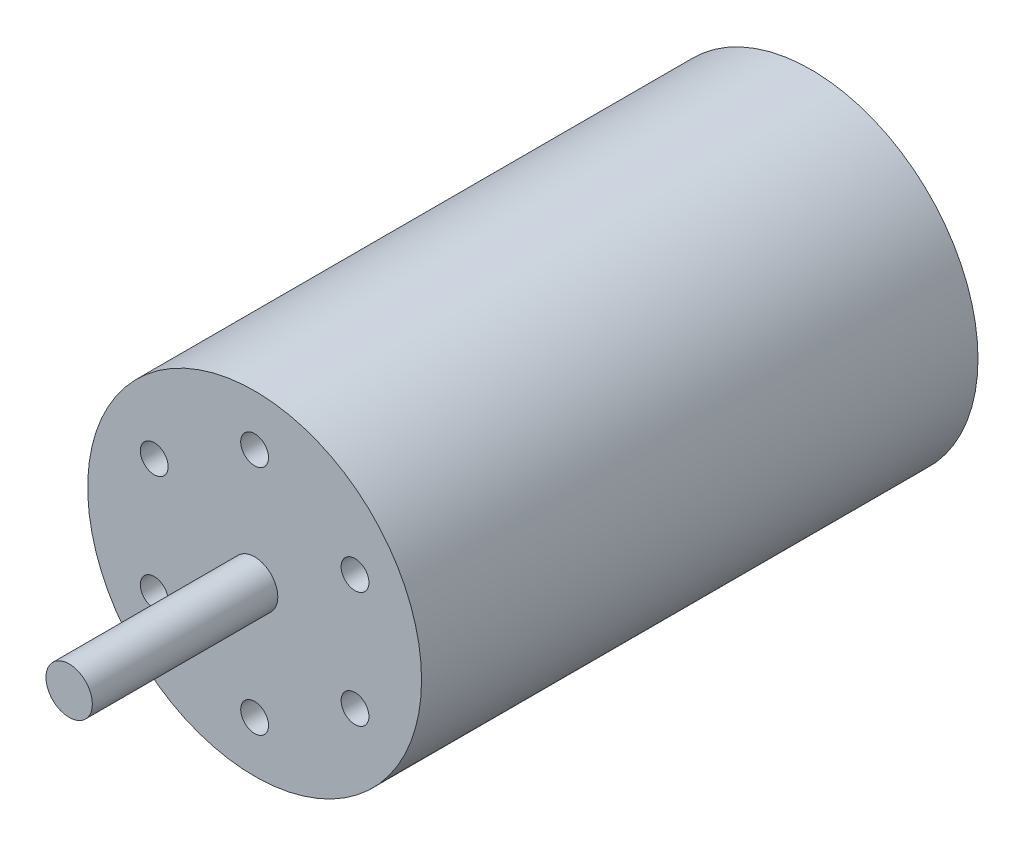
ISO-10303-21;
HEADER;
FILE_DESCRIPTION(('STEP AP214'),'2;1');
FILE_NAME('part.step','',(''),(''),'','','');
FILE_SCHEMA(('AUTOMOTIVE_DESIGN { 1 0 10303 214 1 1 1 1 }'));
ENDSEC;
DATA;
#1=APPLICATION_CONTEXT('core data for automotive mechanical design processes');
#2=APPLICATION_PROTOCOL_DEFINITION('international standard','automotive_design',2000,#1);
#3=PRODUCT_CONTEXT('',#1,'mechanical');
#4=PRODUCT('Part','Part','',(#3));
#5=PRODUCT_RELATED_PRODUCT_CATEGORY('part','',(#4));
#6=PRODUCT_DEFINITION_FORMATION('','',#4);
#7=PRODUCT_DEFINITION_CONTEXT('part definition',#1,'design');
#8=PRODUCT_DEFINITION('design','',#6,#7);
#9=PRODUCT_DEFINITION_SHAPE('','',#8);
#10=(LENGTH_UNIT() NAMED_UNIT(*) SI_UNIT(.MILLI.,.METRE.));
#11=(NAMED_UNIT(*) PLANE_ANGLE_UNIT() SI_UNIT($,.RADIAN.));
#12=(NAMED_UNIT(*) SI_UNIT($,.STERADIAN.) SOLID_ANGLE_UNIT());
#13=UNCERTAINTY_MEASURE_WITH_UNIT(LENGTH_MEASURE(1.E-05),#10,'distance_accuracy_value','');
#14=(GEOMETRIC_REPRESENTATION_CONTEXT(3) GLOBAL_UNCERTAINTY_ASSIGNED_CONTEXT((#13)) GLOBAL_UNIT_ASSIGNED_CONTEXT((#10,
#11,#12)) REPRESENTATION_CONTEXT('',''));
#15=CARTESIAN_POINT('',(0.,0.,0.));
#16=DIRECTION('',(0.,0.,1.));
#17=DIRECTION('',(1.,0.,0.));
#18=AXIS2_PLACEMENT_3D('',#15,#16,#17);
#19=CARTESIAN_POINT('',(0.,0.,60.));
#20=DIRECTION('',(0.,0.,-1.));
#21=DIRECTION('',(-1.,0.,0.));
#22=AXIS2_PLACEMENT_3D('',#19,#20,#21);
#23=CYLINDRICAL_SURFACE('',#22,18.);
#24=CARTESIAN_POINT('',(0.,0.,60.));
#25=DIRECTION('',(0.,0.,1.));
#26=DIRECTION('',(1.,0.,0.));
#27=AXIS2_PLACEMENT_3D('',#24,#25,#26);
#28=CIRCLE('',#27,18.);
#29=CARTESIAN_POINT('',(18.,0.,60.));
#30=VERTEX_POINT('',#29);
#31=EDGE_CURVE('E10',#30,#30,#28,.T.);
#32=ORIENTED_EDGE('',*,*,#31,.F.);
#33=EDGE_LOOP('',(#32));
#34=FACE_BOUND('',#33,.T.);
#35=CARTESIAN_POINT('',(0.,0.,0.));
#36=DIRECTION('',(0.,0.,1.));
#37=DIRECTION('',(1.,0.,0.));
#38=AXIS2_PLACEMENT_3D('',#35,#36,#37);
#39=CIRCLE('',#38,18.);
#40=CARTESIAN_POINT('',(18.,0.,0.));
#41=VERTEX_POINT('',#40);
#42=EDGE_CURVE('E34',#41,#41,#39,.T.);
#43=ORIENTED_EDGE('',*,*,#42,.T.);
#44=EDGE_LOOP('',(#43));
#45=FACE_BOUND('',#44,.T.);
#46=ADVANCED_FACE('F31',(#34,#45),#23,.T.);
#47=CARTESIAN_POINT('',(0.,0.,60.));
#48=DIRECTION('',(0.,0.,1.));
#49=DIRECTION('',(1.,0.,0.));
#50=AXIS2_PLACEMENT_3D('',#47,#48,#49);
#51=PLANE('',#50);
#52=CARTESIAN_POINT('',(10.8253175473058,6.25000000000062,60.));
#53=DIRECTION('',(0.,0.,1.));
#54=DIRECTION('',(1.,0.,0.));
#55=AXIS2_PLACEMENT_3D('',#52,#53,#54);
#56=CIRCLE('',#55,1.50000000000019);
#57=CARTESIAN_POINT('',(12.325317547306,6.25000000000062,60.));
#58=VERTEX_POINT('',#57);
#59=EDGE_CURVE('E79',#58,#58,#56,.T.);
#60=ORIENTED_EDGE('',*,*,#59,.F.);
#61=EDGE_LOOP('',(#60));
#62=FACE_BOUND('',#61,.T.);
#63=CARTESIAN_POINT('',(10.8253175473065,-6.24999999999939,60.));
#64=DIRECTION('',(0.,0.,1.));
#65=DIRECTION('',(1.,0.,0.));
#66=AXIS2_PLACEMENT_3D('',#63,#64,#65);
#67=CIRCLE('',#66,1.5000000000009);
#68=CARTESIAN_POINT('',(12.3253175473074,-6.24999999999939,60.));
#69=VERTEX_POINT('',#68);
#70=EDGE_CURVE('E73',#69,#69,#67,.T.);
#71=ORIENTED_EDGE('',*,*,#70,.F.);
#72=EDGE_LOOP('',(#71));
#73=FACE_BOUND('',#72,.T.);
#74=CARTESIAN_POINT('',(1.41802385452233E-12,-12.5,60.));
#75=DIRECTION('',(0.,0.,1.));
#76=DIRECTION('',(1.,0.,0.));
#77=AXIS2_PLACEMENT_3D('',#74,#75,#76);
#78=CIRCLE('',#77,1.50000000000144);
#79=CARTESIAN_POINT('',(1.50000000000286,-12.5,60.));
#80=VERTEX_POINT('',#79);
#81=EDGE_CURVE('E67',#80,#80,#78,.T.);
#82=ORIENTED_EDGE('',*,*,#81,.F.);
#83=EDGE_LOOP('',(#82));
#84=FACE_BOUND('',#83,.T.);
#85=CARTESIAN_POINT('',(-10.8253175473044,-6.25000000000062,60.));
#86=DIRECTION('',(0.,0.,1.));
#87=DIRECTION('',(1.,0.,0.));
#88=AXIS2_PLACEMENT_3D('',#85,#86,#87);
#89=CIRCLE('',#88,1.50000000000131);
#90=CARTESIAN_POINT('',(-9.32531754730311,-6.25000000000062,60.));
#91=VERTEX_POINT('',#90);
#92=EDGE_CURVE('E61',#91,#91,#89,.T.);
#93=ORIENTED_EDGE('',*,*,#92,.F.);
#94=EDGE_LOOP('',(#93));
#95=FACE_BOUND('',#94,.T.);
#96=CARTESIAN_POINT('',(-10.8253175473051,6.24999999999938,60.));
#97=DIRECTION('',(0.,0.,1.));
#98=DIRECTION('',(1.,0.,0.));
#99=AXIS2_PLACEMENT_3D('',#96,#97,#98);
#100=CIRCLE('',#99,1.50000000000067);
#101=CARTESIAN_POINT('',(-9.32531754730447,6.24999999999938,60.));
#102=VERTEX_POINT('',#101);
#103=EDGE_CURVE('E55',#102,#102,#100,.T.);
#104=ORIENTED_EDGE('',*,*,#103,.F.);
#105=EDGE_LOOP('',(#104));
#106=FACE_BOUND('',#105,.T.);
#107=CARTESIAN_POINT('',(0.,12.5,60.));
#108=DIRECTION('',(0.,0.,1.));
#109=DIRECTION('',(1.,0.,0.));
#110=AXIS2_PLACEMENT_3D('',#107,#108,#109);
#111=CIRCLE('',#110,1.5);
#112=CARTESIAN_POINT('',(1.5,12.5,60.));
#113=VERTEX_POINT('',#112);
#114=EDGE_CURVE('E49',#113,#113,#111,.T.);
#115=ORIENTED_EDGE('',*,*,#114,.F.);
#116=EDGE_LOOP('',(#115));
#117=FACE_BOUND('',#116,.T.);
#118=CARTESIAN_POINT('',(0.,0.,60.));
#119=DIRECTION('',(0.,0.,1.));
#120=DIRECTION('',(1.,0.,0.));
#121=AXIS2_PLACEMENT_3D('',#118,#119,#120);
#122=CIRCLE('',#121,2.5);
#123=CARTESIAN_POINT('',(2.5,0.,60.));
#124=VERTEX_POINT('',#123);
#125=EDGE_CURVE('E43',#124,#124,#122,.T.);
#126=ORIENTED_EDGE('',*,*,#125,.F.);
#127=EDGE_LOOP('',(#126));
#128=FACE_BOUND('',#127,.T.);
#129=ORIENTED_EDGE('',*,*,#31,.T.);
#130=EDGE_LOOP('',(#129));
#131=FACE_BOUND('',#130,.T.);
#132=ADVANCED_FACE('F94',(#62,#73,#84,#95,#106,#117,#128,#131),#51,.T.);
#133=CARTESIAN_POINT('',(0.,0.,0.));
#134=DIRECTION('',(0.,0.,1.));
#135=DIRECTION('',(1.,0.,0.));
#136=AXIS2_PLACEMENT_3D('',#133,#134,#135);
#137=PLANE('',#136);
#138=ORIENTED_EDGE('',*,*,#42,.F.);
#139=EDGE_LOOP('',(#138));
#140=FACE_BOUND('',#139,.T.);
#141=ADVANCED_FACE('F97',(#140),#137,.F.);
#142=CARTESIAN_POINT('',(0.,0.,80.));
#143=DIRECTION('',(0.,0.,-1.));
#144=DIRECTION('',(-1.,0.,0.));
#145=AXIS2_PLACEMENT_3D('',#142,#143,#144);
#146=CYLINDRICAL_SURFACE('',#145,2.5);
#147=CARTESIAN_POINT('',(0.,0.,80.));
#148=DIRECTION('',(0.,0.,1.));
#149=DIRECTION('',(1.,0.,0.));
#150=AXIS2_PLACEMENT_3D('',#147,#148,#149);
#151=CIRCLE('',#150,2.5);
#152=CARTESIAN_POINT('',(2.5,0.,80.));
#153=VERTEX_POINT('',#152);
#154=EDGE_CURVE('E41',#153,#153,#151,.T.);
#155=ORIENTED_EDGE('',*,*,#154,.F.);
#156=EDGE_LOOP('',(#155));
#157=FACE_BOUND('',#156,.T.);
#158=ORIENTED_EDGE('',*,*,#125,.T.);
#159=EDGE_LOOP('',(#158));
#160=FACE_BOUND('',#159,.T.);
#161=ADVANCED_FACE('F111',(#157,#160),#146,.T.);
#162=CARTESIAN_POINT('',(0.,0.,80.));
#163=DIRECTION('',(0.,0.,1.));
#164=DIRECTION('',(1.,0.,0.));
#165=AXIS2_PLACEMENT_3D('',#162,#163,#164);
#166=PLANE('',#165);
#167=ORIENTED_EDGE('',*,*,#154,.T.);
#168=EDGE_LOOP('',(#167));
#169=FACE_BOUND('',#168,.T.);
#170=ADVANCED_FACE('F113',(#169),#166,.T.);
#171=CARTESIAN_POINT('',(0.,12.5,50.));
#172=DIRECTION('',(0.,0.,1.));
#173=DIRECTION('',(1.,0.,0.));
#174=AXIS2_PLACEMENT_3D('',#171,#172,#173);
#175=CYLINDRICAL_SURFACE('',#174,1.5);
#176=CARTESIAN_POINT('',(0.,12.5,50.));
#177=DIRECTION('',(0.,0.,1.));
#178=DIRECTION('',(1.,0.,0.));
#179=AXIS2_PLACEMENT_3D('',#176,#177,#178);
#180=CIRCLE('',#179,1.5);
#181=CARTESIAN_POINT('',(1.5,12.5,50.));
#182=VERTEX_POINT('',#181);
#183=EDGE_CURVE('E46',#182,#182,#180,.T.);
#184=ORIENTED_EDGE('',*,*,#183,.F.);
#185=EDGE_LOOP('',(#184));
#186=FACE_BOUND('',#185,.T.);
#187=ORIENTED_EDGE('',*,*,#114,.T.);
#188=EDGE_LOOP('',(#187));
#189=FACE_BOUND('',#188,.T.);
#190=ADVANCED_FACE('F120',(#186,#189),#175,.F.);
#191=CARTESIAN_POINT('',(0.,12.5,50.));
#192=DIRECTION('',(0.,0.,1.));
#193=DIRECTION('',(1.,0.,0.));
#194=AXIS2_PLACEMENT_3D('',#191,#192,#193);
#195=PLANE('',#194);
#196=ORIENTED_EDGE('',*,*,#183,.T.);
#197=EDGE_LOOP('',(#196));
#198=FACE_BOUND('',#197,.T.);
#199=ADVANCED_FACE('F160',(#198),#195,.T.);
#200=CARTESIAN_POINT('',(-10.8253175473051,6.24999999999938,50.));
#201=DIRECTION('',(0.,0.,1.));
#202=DIRECTION('',(1.,0.,0.));
#203=AXIS2_PLACEMENT_3D('',#200,#201,#202);
#204=CYLINDRICAL_SURFACE('',#203,1.50000000000067);
#205=CARTESIAN_POINT('',(-10.8253175473051,6.24999999999938,50.));
#206=DIRECTION('',(0.,0.,1.));
#207=DIRECTION('',(1.,0.,0.));
#208=AXIS2_PLACEMENT_3D('',#205,#206,#207);
#209=CIRCLE('',#208,1.50000000000067);
#210=CARTESIAN_POINT('',(-9.32531754730447,6.24999999999938,50.));
#211=VERTEX_POINT('',#210);
#212=EDGE_CURVE('E58',#211,#211,#209,.T.);
#213=ORIENTED_EDGE('',*,*,#212,.F.);
#214=EDGE_LOOP('',(#213));
#215=FACE_BOUND('',#214,.T.);
#216=ORIENTED_EDGE('',*,*,#103,.T.);
#217=EDGE_LOOP('',(#216));
#218=FACE_BOUND('',#217,.T.);
#219=ADVANCED_FACE('F167',(#215,#218),#204,.F.);
#220=CARTESIAN_POINT('',(-10.8253175473051,6.24999999999938,50.));
#221=DIRECTION('',(0.,0.,1.));
#222=DIRECTION('',(1.,0.,0.));
#223=AXIS2_PLACEMENT_3D('',#220,#221,#222);
#224=PLANE('',#223);
#225=ORIENTED_EDGE('',*,*,#212,.T.);
#226=EDGE_LOOP('',(#225));
#227=FACE_BOUND('',#226,.T.);
#228=ADVANCED_FACE('F175',(#227),#224,.T.);
#229=CARTESIAN_POINT('',(-10.8253175473044,-6.25000000000062,50.));
#230=DIRECTION('',(0.,0.,1.));
#231=DIRECTION('',(1.,0.,0.));
#232=AXIS2_PLACEMENT_3D('',#229,#230,#231);
#233=CYLINDRICAL_SURFACE('',#232,1.50000000000131);
#234=CARTESIAN_POINT('',(-10.8253175473044,-6.25000000000062,50.));
#235=DIRECTION('',(0.,0.,1.));
#236=DIRECTION('',(1.,0.,0.));
#237=AXIS2_PLACEMENT_3D('',#234,#235,#236);
#238=CIRCLE('',#237,1.50000000000131);
#239=CARTESIAN_POINT('',(-9.32531754730311,-6.25000000000062,50.));
#240=VERTEX_POINT('',#239);
#241=EDGE_CURVE('E64',#240,#240,#238,.T.);
#242=ORIENTED_EDGE('',*,*,#241,.F.);
#243=EDGE_LOOP('',(#242));
#244=FACE_BOUND('',#243,.T.);
#245=ORIENTED_EDGE('',*,*,#92,.T.);
#246=EDGE_LOOP('',(#245));
#247=FACE_BOUND('',#246,.T.);
#248=ADVANCED_FACE('F183',(#244,#247),#233,.F.);
#249=CARTESIAN_POINT('',(-10.8253175473044,-6.25000000000062,50.));
#250=DIRECTION('',(0.,0.,1.));
#251=DIRECTION('',(1.,0.,0.));
#252=AXIS2_PLACEMENT_3D('',#249,#250,#251);
#253=PLANE('',#252);
#254=ORIENTED_EDGE('',*,*,#241,.T.);
#255=EDGE_LOOP('',(#254));
#256=FACE_BOUND('',#255,.T.);
#257=ADVANCED_FACE('F191',(#256),#253,.T.);
#258=CARTESIAN_POINT('',(1.41802385452233E-12,-12.5,50.));
#259=DIRECTION('',(0.,0.,1.));
#260=DIRECTION('',(1.,0.,0.));
#261=AXIS2_PLACEMENT_3D('',#258,#259,#260);
#262=CYLINDRICAL_SURFACE('',#261,1.50000000000144);
#263=CARTESIAN_POINT('',(1.41802385452233E-12,-12.5,50.));
#264=DIRECTION('',(0.,0.,1.));
#265=DIRECTION('',(1.,0.,0.));
#266=AXIS2_PLACEMENT_3D('',#263,#264,#265);
#267=CIRCLE('',#266,1.50000000000144);
#268=CARTESIAN_POINT('',(1.50000000000286,-12.5,50.));
#269=VERTEX_POINT('',#268);
#270=EDGE_CURVE('E70',#269,#269,#267,.T.);
#271=ORIENTED_EDGE('',*,*,#270,.F.);
#272=EDGE_LOOP('',(#271));
#273=FACE_BOUND('',#272,.T.);
#274=ORIENTED_EDGE('',*,*,#81,.T.);
#275=EDGE_LOOP('',(#274));
#276=FACE_BOUND('',#275,.T.);
#277=ADVANCED_FACE('F199',(#273,#276),#262,.F.);
#278=CARTESIAN_POINT('',(1.41802385452233E-12,-12.5,50.));
#279=DIRECTION('',(0.,0.,1.));
#280=DIRECTION('',(1.,0.,0.));
#281=AXIS2_PLACEMENT_3D('',#278,#279,#280);
#282=PLANE('',#281);
#283=ORIENTED_EDGE('',*,*,#270,.T.);
#284=EDGE_LOOP('',(#283));
#285=FACE_BOUND('',#284,.T.);
#286=ADVANCED_FACE('F207',(#285),#282,.T.);
#287=CARTESIAN_POINT('',(10.8253175473065,-6.24999999999939,50.));
#288=DIRECTION('',(0.,0.,1.));
#289=DIRECTION('',(1.,0.,0.));
#290=AXIS2_PLACEMENT_3D('',#287,#288,#289);
#291=CYLINDRICAL_SURFACE('',#290,1.5000000000009);
#292=CARTESIAN_POINT('',(10.8253175473065,-6.24999999999939,50.));
#293=DIRECTION('',(0.,0.,1.));
#294=DIRECTION('',(1.,0.,0.));
#295=AXIS2_PLACEMENT_3D('',#292,#293,#294);
#296=CIRCLE('',#295,1.5000000000009);
#297=CARTESIAN_POINT('',(12.3253175473074,-6.24999999999939,50.));
#298=VERTEX_POINT('',#297);
#299=EDGE_CURVE('E76',#298,#298,#296,.T.);
#300=ORIENTED_EDGE('',*,*,#299,.F.);
#301=EDGE_LOOP('',(#300));
#302=FACE_BOUND('',#301,.T.);
#303=ORIENTED_EDGE('',*,*,#70,.T.);
#304=EDGE_LOOP('',(#303));
#305=FACE_BOUND('',#304,.T.);
#306=ADVANCED_FACE('F215',(#302,#305),#291,.F.);
#307=CARTESIAN_POINT('',(10.8253175473065,-6.24999999999939,50.));
#308=DIRECTION('',(0.,0.,1.));
#309=DIRECTION('',(1.,0.,0.));
#310=AXIS2_PLACEMENT_3D('',#307,#308,#309);
#311=PLANE('',#310);
#312=ORIENTED_EDGE('',*,*,#299,.T.);
#313=EDGE_LOOP('',(#312));
#314=FACE_BOUND('',#313,.T.);
#315=ADVANCED_FACE('F90',(#314),#311,.T.);
#316=CARTESIAN_POINT('',(10.8253175473058,6.25000000000062,50.));
#317=DIRECTION('',(0.,0.,1.));
#318=DIRECTION('',(1.,0.,0.));
#319=AXIS2_PLACEMENT_3D('',#316,#317,#318);
#320=CYLINDRICAL_SURFACE('',#319,1.50000000000019);
#321=CARTESIAN_POINT('',(10.8253175473058,6.25000000000062,50.));
#322=DIRECTION('',(0.,0.,1.));
#323=DIRECTION('',(1.,0.,0.));
#324=AXIS2_PLACEMENT_3D('',#321,#322,#323);
#325=CIRCLE('',#324,1.50000000000019);
#326=CARTESIAN_POINT('',(12.325317547306,6.25000000000062,50.));
#327=VERTEX_POINT('',#326);
#328=EDGE_CURVE('E52',#327,#327,#325,.T.);
#329=ORIENTED_EDGE('',*,*,#328,.F.);
#330=EDGE_LOOP('',(#329));
#331=FACE_BOUND('',#330,.T.);
#332=ORIENTED_EDGE('',*,*,#59,.T.);
#333=EDGE_LOOP('',(#332));
#334=FACE_BOUND('',#333,.T.);
#335=ADVANCED_FACE('F87',(#331,#334),#320,.F.);
#336=CARTESIAN_POINT('',(10.8253175473058,6.25000000000062,50.));
#337=DIRECTION('',(0.,0.,1.));
#338=DIRECTION('',(1.,0.,0.));
#339=AXIS2_PLACEMENT_3D('',#336,#337,#338);
#340=PLANE('',#339);
#341=ORIENTED_EDGE('',*,*,#328,.T.);
#342=EDGE_LOOP('',(#341));
#343=FACE_BOUND('',#342,.T.);
#344=ADVANCED_FACE('F85',(#343),#340,.T.);
#345=CLOSED_SHELL('',(#46,#132,#141,#161,#170,#190,#199,#219,#228,#248,#257,#277,#286,#306,#315,
#335,#344));
#346=MANIFOLD_SOLID_BREP('B2',#345);
#347=ADVANCED_BREP_SHAPE_REPRESENTATION('',(#18,#346),#14);
#348=SHAPE_DEFINITION_REPRESENTATION(#9,#347);
ENDSEC;
END-ISO-10303-21;
